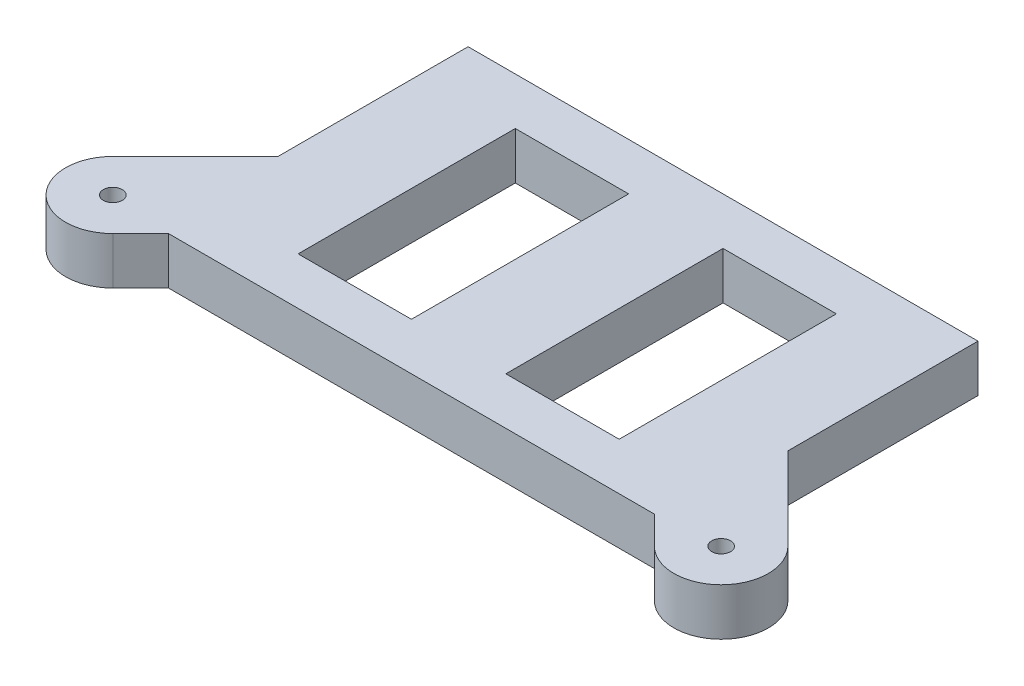
ISO-10303-21;
HEADER;
FILE_DESCRIPTION(('STEP AP214'),'2;1');
FILE_NAME('part.step','',(''),(''),'','','');
FILE_SCHEMA(('AUTOMOTIVE_DESIGN { 1 0 10303 214 1 1 1 1 }'));
ENDSEC;
DATA;
#1=APPLICATION_CONTEXT('core data for automotive mechanical design processes');
#2=APPLICATION_PROTOCOL_DEFINITION('international standard','automotive_design',2000,#1);
#3=PRODUCT_CONTEXT('',#1,'mechanical');
#4=PRODUCT('Part','Part','',(#3));
#5=PRODUCT_RELATED_PRODUCT_CATEGORY('part','',(#4));
#6=PRODUCT_DEFINITION_FORMATION('','',#4);
#7=PRODUCT_DEFINITION_CONTEXT('part definition',#1,'design');
#8=PRODUCT_DEFINITION('design','',#6,#7);
#9=PRODUCT_DEFINITION_SHAPE('','',#8);
#10=(LENGTH_UNIT() NAMED_UNIT(*) SI_UNIT(.MILLI.,.METRE.));
#11=(NAMED_UNIT(*) PLANE_ANGLE_UNIT() SI_UNIT($,.RADIAN.));
#12=(NAMED_UNIT(*) SI_UNIT($,.STERADIAN.) SOLID_ANGLE_UNIT());
#13=UNCERTAINTY_MEASURE_WITH_UNIT(LENGTH_MEASURE(1.E-05),#10,'distance_accuracy_value','');
#14=(GEOMETRIC_REPRESENTATION_CONTEXT(3) GLOBAL_UNCERTAINTY_ASSIGNED_CONTEXT((#13)) GLOBAL_UNIT_ASSIGNED_CONTEXT((#10,
#11,#12)) REPRESENTATION_CONTEXT('',''));
#15=CARTESIAN_POINT('',(0.,0.,0.));
#16=DIRECTION('',(0.,0.,1.));
#17=DIRECTION('',(1.,0.,0.));
#18=AXIS2_PLACEMENT_3D('',#15,#16,#17);
#19=CARTESIAN_POINT('',(0.,5.,0.));
#20=DIRECTION('',(0.,-1.,0.));
#21=DIRECTION('',(0.,0.,-1.));
#22=AXIS2_PLACEMENT_3D('',#19,#20,#21);
#23=PLANE('',#22);
#24=DIRECTION('',(0.,0.,1.));
#25=VECTOR('',#24,1.);
#26=CARTESIAN_POINT('',(10.,5.,-28.));
#27=LINE('',#26,#25);
#28=CARTESIAN_POINT('',(10.,5.,-28.));
#29=VERTEX_POINT('',#28);
#30=CARTESIAN_POINT('',(10.,5.,-5.));
#31=VERTEX_POINT('',#30);
#32=EDGE_CURVE('E303',#29,#31,#27,.T.);
#33=ORIENTED_EDGE('',*,*,#32,.F.);
#34=DIRECTION('',(-1.,0.,0.));
#35=VECTOR('',#34,1.);
#36=CARTESIAN_POINT('',(10.,5.,-28.));
#37=LINE('',#36,#35);
#38=CARTESIAN_POINT('',(22.,5.,-28.));
#39=VERTEX_POINT('',#38);
#40=EDGE_CURVE('E314',#39,#29,#37,.T.);
#41=ORIENTED_EDGE('',*,*,#40,.F.);
#42=DIRECTION('',(0.,0.,-1.));
#43=VECTOR('',#42,1.);
#44=CARTESIAN_POINT('',(22.,5.,-28.));
#45=LINE('',#44,#43);
#46=CARTESIAN_POINT('',(22.,5.,-5.));
#47=VERTEX_POINT('',#46);
#48=EDGE_CURVE('E310',#47,#39,#45,.T.);
#49=ORIENTED_EDGE('',*,*,#48,.F.);
#50=DIRECTION('',(1.,0.,0.));
#51=VECTOR('',#50,1.);
#52=CARTESIAN_POINT('',(10.,5.,-5.));
#53=LINE('',#52,#51);
#54=EDGE_CURVE('E306',#31,#47,#53,.T.);
#55=ORIENTED_EDGE('',*,*,#54,.F.);
#56=EDGE_LOOP('',(#33,#41,#49,#55));
#57=FACE_BOUND('',#56,.T.);
#58=DIRECTION('',(0.,0.,1.));
#59=VECTOR('',#58,1.);
#60=CARTESIAN_POINT('',(0.,5.,0.));
#61=LINE('',#60,#59);
#62=CARTESIAN_POINT('',(0.,5.,-33.));
#63=VERTEX_POINT('',#62);
#64=CARTESIAN_POINT('',(0.,5.,-12.8710678118655));
#65=VERTEX_POINT('',#64);
#66=EDGE_CURVE('E346',#63,#65,#61,.T.);
#67=ORIENTED_EDGE('',*,*,#66,.T.);
#68=DIRECTION('',(0.707106781186544,0.,-0.707106781186551));
#69=VECTOR('',#68,1.);
#70=CARTESIAN_POINT('',(-8.74873734152914,5.,-4.12233047033624));
#71=LINE('',#70,#69);
#72=CARTESIAN_POINT('',(-8.74873734152914,5.,-4.12233047033624));
#73=VERTEX_POINT('',#72);
#74=EDGE_CURVE('E227',#73,#65,#71,.T.);
#75=ORIENTED_EDGE('',*,*,#74,.F.);
#76=CARTESIAN_POINT('',(-5.21320343559638,5.,-0.586796564403524));
#77=DIRECTION('',(0.,-1.,0.));
#78=DIRECTION('',(0.,0.,-1.));
#79=AXIS2_PLACEMENT_3D('',#76,#77,#78);
#80=CIRCLE('',#79,5.);
#81=CARTESIAN_POINT('',(-1.67766952966347,5.,2.94873734152904));
#82=VERTEX_POINT('',#81);
#83=EDGE_CURVE('E223',#82,#73,#80,.T.);
#84=ORIENTED_EDGE('',*,*,#83,.F.);
#85=DIRECTION('',(-0.707106781186544,0.,0.707106781186551));
#86=VECTOR('',#85,1.);
#87=CARTESIAN_POINT('',(-1.67766952966347,5.,2.94873734152904));
#88=LINE('',#87,#86);
#89=CARTESIAN_POINT('',(1.27106781186554,5.,0.));
#90=VERTEX_POINT('',#89);
#91=EDGE_CURVE('E232',#90,#82,#88,.T.);
#92=ORIENTED_EDGE('',*,*,#91,.F.);
#93=DIRECTION('',(1.,0.,0.));
#94=VECTOR('',#93,1.);
#95=CARTESIAN_POINT('',(0.,5.,0.));
#96=LINE('',#95,#94);
#97=CARTESIAN_POINT('',(52.7289321881347,5.,0.));
#98=VERTEX_POINT('',#97);
#99=EDGE_CURVE('E349',#90,#98,#96,.T.);
#100=ORIENTED_EDGE('',*,*,#99,.T.);
#101=DIRECTION('',(-0.70710678118655,0.,-0.707106781186545));
#102=VECTOR('',#101,1.);
#103=CARTESIAN_POINT('',(55.6776695296638,5.,2.94873734152904));
#104=LINE('',#103,#102);
#105=CARTESIAN_POINT('',(55.6776695296638,5.,2.94873734152904));
#106=VERTEX_POINT('',#105);
#107=EDGE_CURVE('E184',#106,#98,#104,.T.);
#108=ORIENTED_EDGE('',*,*,#107,.F.);
#109=CARTESIAN_POINT('',(59.2132034355965,5.,-0.586796564403698));
#110=DIRECTION('',(0.,-1.,0.));
#111=DIRECTION('',(0.,0.,-1.));
#112=AXIS2_PLACEMENT_3D('',#109,#110,#111);
#113=CIRCLE('',#112,4.99999999999999);
#114=CARTESIAN_POINT('',(62.7487373415293,5.,-4.12233047033644));
#115=VERTEX_POINT('',#114);
#116=EDGE_CURVE('E166',#115,#106,#113,.T.);
#117=ORIENTED_EDGE('',*,*,#116,.F.);
#118=DIRECTION('',(0.707106781186549,0.,0.707106781186547));
#119=VECTOR('',#118,1.);
#120=CARTESIAN_POINT('',(62.7487373415293,5.,-4.12233047033644));
#121=LINE('',#120,#119);
#122=CARTESIAN_POINT('',(54.,5.,-12.8710678118657));
#123=VERTEX_POINT('',#122);
#124=EDGE_CURVE('E182',#123,#115,#121,.T.);
#125=ORIENTED_EDGE('',*,*,#124,.F.);
#126=DIRECTION('',(0.,0.,-1.));
#127=VECTOR('',#126,1.);
#128=CARTESIAN_POINT('',(54.,5.,0.));
#129=LINE('',#128,#127);
#130=CARTESIAN_POINT('',(54.,5.,-33.));
#131=VERTEX_POINT('',#130);
#132=EDGE_CURVE('E353',#123,#131,#129,.T.);
#133=ORIENTED_EDGE('',*,*,#132,.T.);
#134=DIRECTION('',(-1.,0.,0.));
#135=VECTOR('',#134,1.);
#136=CARTESIAN_POINT('',(0.,5.,-33.));
#137=LINE('',#136,#135);
#138=EDGE_CURVE('E356',#131,#63,#137,.T.);
#139=ORIENTED_EDGE('',*,*,#138,.T.);
#140=EDGE_LOOP('',(#67,#75,#84,#92,#100,#108,#117,#125,#133,#139));
#141=FACE_BOUND('',#140,.T.);
#142=DIRECTION('',(0.,0.,1.));
#143=VECTOR('',#142,1.);
#144=CARTESIAN_POINT('',(32.,5.,-28.));
#145=LINE('',#144,#143);
#146=CARTESIAN_POINT('',(32.,5.,-28.));
#147=VERTEX_POINT('',#146);
#148=CARTESIAN_POINT('',(32.,5.,-5.));
#149=VERTEX_POINT('',#148);
#150=EDGE_CURVE('E260',#147,#149,#145,.T.);
#151=ORIENTED_EDGE('',*,*,#150,.F.);
#152=DIRECTION('',(-1.,0.,0.));
#153=VECTOR('',#152,1.);
#154=CARTESIAN_POINT('',(32.,5.,-28.));
#155=LINE('',#154,#153);
#156=CARTESIAN_POINT('',(44.,5.,-28.));
#157=VERTEX_POINT('',#156);
#158=EDGE_CURVE('E271',#157,#147,#155,.T.);
#159=ORIENTED_EDGE('',*,*,#158,.F.);
#160=DIRECTION('',(0.,0.,-1.));
#161=VECTOR('',#160,1.);
#162=CARTESIAN_POINT('',(44.,5.,-28.));
#163=LINE('',#162,#161);
#164=CARTESIAN_POINT('',(44.,5.,-5.));
#165=VERTEX_POINT('',#164);
#166=EDGE_CURVE('E267',#165,#157,#163,.T.);
#167=ORIENTED_EDGE('',*,*,#166,.F.);
#168=DIRECTION('',(1.,0.,0.));
#169=VECTOR('',#168,1.);
#170=CARTESIAN_POINT('',(32.,5.,-5.));
#171=LINE('',#170,#169);
#172=EDGE_CURVE('E263',#149,#165,#171,.T.);
#173=ORIENTED_EDGE('',*,*,#172,.F.);
#174=EDGE_LOOP('',(#151,#159,#167,#173));
#175=FACE_BOUND('',#174,.T.);
#176=CARTESIAN_POINT('',(-5.21320343559638,5.,-0.586796564403524));
#177=DIRECTION('',(0.,-1.,0.));
#178=DIRECTION('',(0.,0.,-1.));
#179=AXIS2_PLACEMENT_3D('',#176,#177,#178);
#180=CIRCLE('',#179,1.);
#181=CARTESIAN_POINT('',(-5.21320343559638,5.,-1.58679656440352));
#182=VERTEX_POINT('',#181);
#183=EDGE_CURVE('E215',#182,#182,#180,.T.);
#184=ORIENTED_EDGE('',*,*,#183,.T.);
#185=EDGE_LOOP('',(#184));
#186=FACE_BOUND('',#185,.T.);
#187=CARTESIAN_POINT('',(59.2132034355965,5.,-0.586796564403698));
#188=DIRECTION('',(0.,-1.,0.));
#189=DIRECTION('',(0.,0.,-1.));
#190=AXIS2_PLACEMENT_3D('',#187,#188,#189);
#191=CIRCLE('',#190,0.999999999999998);
#192=CARTESIAN_POINT('',(59.2132034355965,5.,-1.5867965644037));
#193=VERTEX_POINT('',#192);
#194=EDGE_CURVE('E205',#193,#193,#191,.T.);
#195=ORIENTED_EDGE('',*,*,#194,.T.);
#196=EDGE_LOOP('',(#195));
#197=FACE_BOUND('',#196,.T.);
#198=ADVANCED_FACE('F39',(#57,#141,#175,#186,#197),#23,.F.);
#199=CARTESIAN_POINT('',(0.,0.,0.));
#200=DIRECTION('',(0.,-1.,0.));
#201=DIRECTION('',(0.,0.,-1.));
#202=AXIS2_PLACEMENT_3D('',#199,#200,#201);
#203=PLANE('',#202);
#204=DIRECTION('',(0.,0.,1.));
#205=VECTOR('',#204,1.);
#206=CARTESIAN_POINT('',(0.,0.,0.));
#207=LINE('',#206,#205);
#208=CARTESIAN_POINT('',(0.,0.,-33.));
#209=VERTEX_POINT('',#208);
#210=CARTESIAN_POINT('',(0.,0.,-12.8710678118655));
#211=VERTEX_POINT('',#210);
#212=EDGE_CURVE('E345',#209,#211,#207,.T.);
#213=ORIENTED_EDGE('',*,*,#212,.F.);
#214=DIRECTION('',(-1.,0.,0.));
#215=VECTOR('',#214,1.);
#216=CARTESIAN_POINT('',(0.,0.,-33.));
#217=LINE('',#216,#215);
#218=CARTESIAN_POINT('',(54.,0.,-33.));
#219=VERTEX_POINT('',#218);
#220=EDGE_CURVE('E350',#219,#209,#217,.T.);
#221=ORIENTED_EDGE('',*,*,#220,.F.);
#222=DIRECTION('',(0.,0.,-1.));
#223=VECTOR('',#222,1.);
#224=CARTESIAN_POINT('',(54.,0.,0.));
#225=LINE('',#224,#223);
#226=CARTESIAN_POINT('',(54.,0.,-12.8710678118657));
#227=VERTEX_POINT('',#226);
#228=EDGE_CURVE('E363',#227,#219,#225,.T.);
#229=ORIENTED_EDGE('',*,*,#228,.F.);
#230=DIRECTION('',(0.707106781186549,0.,0.707106781186547));
#231=VECTOR('',#230,1.);
#232=CARTESIAN_POINT('',(62.7487373415293,0.,-4.12233047033644));
#233=LINE('',#232,#231);
#234=CARTESIAN_POINT('',(62.7487373415293,0.,-4.12233047033644));
#235=VERTEX_POINT('',#234);
#236=EDGE_CURVE('E202',#227,#235,#233,.T.);
#237=ORIENTED_EDGE('',*,*,#236,.T.);
#238=CARTESIAN_POINT('',(59.2132034355965,0.,-0.586796564403698));
#239=DIRECTION('',(0.,-1.,0.));
#240=DIRECTION('',(0.,0.,-1.));
#241=AXIS2_PLACEMENT_3D('',#238,#239,#240);
#242=CIRCLE('',#241,4.99999999999999);
#243=CARTESIAN_POINT('',(55.6776695296638,0.,2.94873734152904));
#244=VERTEX_POINT('',#243);
#245=EDGE_CURVE('E168',#235,#244,#242,.T.);
#246=ORIENTED_EDGE('',*,*,#245,.T.);
#247=DIRECTION('',(-0.70710678118655,0.,-0.707106781186545));
#248=VECTOR('',#247,1.);
#249=CARTESIAN_POINT('',(55.6776695296638,0.,2.94873734152904));
#250=LINE('',#249,#248);
#251=CARTESIAN_POINT('',(52.7289321881347,0.,0.));
#252=VERTEX_POINT('',#251);
#253=EDGE_CURVE('E191',#244,#252,#250,.T.);
#254=ORIENTED_EDGE('',*,*,#253,.T.);
#255=DIRECTION('',(1.,0.,0.));
#256=VECTOR('',#255,1.);
#257=CARTESIAN_POINT('',(0.,0.,0.));
#258=LINE('',#257,#256);
#259=CARTESIAN_POINT('',(1.27106781186554,0.,0.));
#260=VERTEX_POINT('',#259);
#261=EDGE_CURVE('E55',#260,#252,#258,.T.);
#262=ORIENTED_EDGE('',*,*,#261,.F.);
#263=DIRECTION('',(-0.707106781186544,0.,0.707106781186551));
#264=VECTOR('',#263,1.);
#265=CARTESIAN_POINT('',(-1.67766952966347,0.,2.94873734152904));
#266=LINE('',#265,#264);
#267=CARTESIAN_POINT('',(-1.67766952966347,0.,2.94873734152904));
#268=VERTEX_POINT('',#267);
#269=EDGE_CURVE('E228',#260,#268,#266,.T.);
#270=ORIENTED_EDGE('',*,*,#269,.T.);
#271=CARTESIAN_POINT('',(-5.21320343559638,0.,-0.586796564403524));
#272=DIRECTION('',(0.,-1.,0.));
#273=DIRECTION('',(0.,0.,-1.));
#274=AXIS2_PLACEMENT_3D('',#271,#272,#273);
#275=CIRCLE('',#274,5.);
#276=CARTESIAN_POINT('',(-8.74873734152914,0.,-4.12233047033624));
#277=VERTEX_POINT('',#276);
#278=EDGE_CURVE('E219',#268,#277,#275,.T.);
#279=ORIENTED_EDGE('',*,*,#278,.T.);
#280=DIRECTION('',(0.707106781186544,0.,-0.707106781186551));
#281=VECTOR('',#280,1.);
#282=CARTESIAN_POINT('',(-8.74873734152914,0.,-4.12233047033624));
#283=LINE('',#282,#281);
#284=EDGE_CURVE('E240',#277,#211,#283,.T.);
#285=ORIENTED_EDGE('',*,*,#284,.T.);
#286=EDGE_LOOP('',(#213,#221,#229,#237,#246,#254,#262,#270,#279,#285));
#287=FACE_BOUND('',#286,.T.);
#288=DIRECTION('',(-1.,0.,0.));
#289=VECTOR('',#288,1.);
#290=CARTESIAN_POINT('',(10.,0.,-28.));
#291=LINE('',#290,#289);
#292=CARTESIAN_POINT('',(22.,0.,-28.));
#293=VERTEX_POINT('',#292);
#294=CARTESIAN_POINT('',(10.,0.,-28.));
#295=VERTEX_POINT('',#294);
#296=EDGE_CURVE('E307',#293,#295,#291,.T.);
#297=ORIENTED_EDGE('',*,*,#296,.T.);
#298=DIRECTION('',(0.,0.,1.));
#299=VECTOR('',#298,1.);
#300=CARTESIAN_POINT('',(10.,0.,-28.));
#301=LINE('',#300,#299);
#302=CARTESIAN_POINT('',(10.,0.,-5.));
#303=VERTEX_POINT('',#302);
#304=EDGE_CURVE('E302',#295,#303,#301,.T.);
#305=ORIENTED_EDGE('',*,*,#304,.T.);
#306=DIRECTION('',(1.,0.,0.));
#307=VECTOR('',#306,1.);
#308=CARTESIAN_POINT('',(10.,0.,-5.));
#309=LINE('',#308,#307);
#310=CARTESIAN_POINT('',(22.,0.,-5.));
#311=VERTEX_POINT('',#310);
#312=EDGE_CURVE('E321',#303,#311,#309,.T.);
#313=ORIENTED_EDGE('',*,*,#312,.T.);
#314=DIRECTION('',(0.,0.,-1.));
#315=VECTOR('',#314,1.);
#316=CARTESIAN_POINT('',(22.,0.,-28.));
#317=LINE('',#316,#315);
#318=EDGE_CURVE('E325',#311,#293,#317,.T.);
#319=ORIENTED_EDGE('',*,*,#318,.T.);
#320=EDGE_LOOP('',(#297,#305,#313,#319));
#321=FACE_BOUND('',#320,.T.);
#322=DIRECTION('',(-1.,0.,0.));
#323=VECTOR('',#322,1.);
#324=CARTESIAN_POINT('',(32.,0.,-28.));
#325=LINE('',#324,#323);
#326=CARTESIAN_POINT('',(44.,0.,-28.));
#327=VERTEX_POINT('',#326);
#328=CARTESIAN_POINT('',(32.,0.,-28.));
#329=VERTEX_POINT('',#328);
#330=EDGE_CURVE('E264',#327,#329,#325,.T.);
#331=ORIENTED_EDGE('',*,*,#330,.T.);
#332=DIRECTION('',(0.,0.,1.));
#333=VECTOR('',#332,1.);
#334=CARTESIAN_POINT('',(32.,0.,-28.));
#335=LINE('',#334,#333);
#336=CARTESIAN_POINT('',(32.,0.,-5.));
#337=VERTEX_POINT('',#336);
#338=EDGE_CURVE('E250',#329,#337,#335,.T.);
#339=ORIENTED_EDGE('',*,*,#338,.T.);
#340=DIRECTION('',(1.,0.,0.));
#341=VECTOR('',#340,1.);
#342=CARTESIAN_POINT('',(32.,0.,-5.));
#343=LINE('',#342,#341);
#344=CARTESIAN_POINT('',(44.,0.,-5.));
#345=VERTEX_POINT('',#344);
#346=EDGE_CURVE('E278',#337,#345,#343,.T.);
#347=ORIENTED_EDGE('',*,*,#346,.T.);
#348=DIRECTION('',(0.,0.,-1.));
#349=VECTOR('',#348,1.);
#350=CARTESIAN_POINT('',(44.,0.,-28.));
#351=LINE('',#350,#349);
#352=EDGE_CURVE('E282',#345,#327,#351,.T.);
#353=ORIENTED_EDGE('',*,*,#352,.T.);
#354=EDGE_LOOP('',(#331,#339,#347,#353));
#355=FACE_BOUND('',#354,.T.);
#356=CARTESIAN_POINT('',(-5.21320343559638,0.,-0.586796564403524));
#357=DIRECTION('',(0.,-1.,0.));
#358=DIRECTION('',(0.,0.,-1.));
#359=AXIS2_PLACEMENT_3D('',#356,#357,#358);
#360=CIRCLE('',#359,1.);
#361=CARTESIAN_POINT('',(-5.21320343559638,0.,-1.58679656440352));
#362=VERTEX_POINT('',#361);
#363=EDGE_CURVE('E210',#362,#362,#360,.T.);
#364=ORIENTED_EDGE('',*,*,#363,.F.);
#365=EDGE_LOOP('',(#364));
#366=FACE_BOUND('',#365,.T.);
#367=CARTESIAN_POINT('',(59.2132034355965,0.,-0.586796564403698));
#368=DIRECTION('',(0.,-1.,0.));
#369=DIRECTION('',(0.,0.,-1.));
#370=AXIS2_PLACEMENT_3D('',#367,#368,#369);
#371=CIRCLE('',#370,0.999999999999998);
#372=CARTESIAN_POINT('',(59.2132034355965,0.,-1.5867965644037));
#373=VERTEX_POINT('',#372);
#374=EDGE_CURVE('E197',#373,#373,#371,.T.);
#375=ORIENTED_EDGE('',*,*,#374,.F.);
#376=EDGE_LOOP('',(#375));
#377=FACE_BOUND('',#376,.T.);
#378=ADVANCED_FACE('F377',(#287,#321,#355,#366,#377),#203,.T.);
#379=CARTESIAN_POINT('',(0.,5.,0.));
#380=DIRECTION('',(1.,0.,0.));
#381=DIRECTION('',(0.,0.,-1.));
#382=AXIS2_PLACEMENT_3D('',#379,#380,#381);
#383=PLANE('',#382);
#384=ORIENTED_EDGE('',*,*,#212,.T.);
#385=DIRECTION('',(0.,-1.,0.));
#386=VECTOR('',#385,1.);
#387=CARTESIAN_POINT('',(0.,5.,-12.8710678118655));
#388=LINE('',#387,#386);
#389=EDGE_CURVE('E254',#65,#211,#388,.T.);
#390=ORIENTED_EDGE('',*,*,#389,.F.);
#391=ORIENTED_EDGE('',*,*,#66,.F.);
#392=DIRECTION('',(0.,-1.,0.));
#393=VECTOR('',#392,1.);
#394=CARTESIAN_POINT('',(0.,5.,-33.));
#395=LINE('',#394,#393);
#396=EDGE_CURVE('E48',#63,#209,#395,.T.);
#397=ORIENTED_EDGE('',*,*,#396,.T.);
#398=EDGE_LOOP('',(#384,#390,#391,#397));
#399=FACE_BOUND('',#398,.T.);
#400=ADVANCED_FACE('F41',(#399),#383,.F.);
#401=CARTESIAN_POINT('',(0.,5.,0.));
#402=DIRECTION('',(0.,0.,-1.));
#403=DIRECTION('',(-1.,0.,0.));
#404=AXIS2_PLACEMENT_3D('',#401,#402,#403);
#405=PLANE('',#404);
#406=ORIENTED_EDGE('',*,*,#261,.T.);
#407=DIRECTION('',(0.,-1.,0.));
#408=VECTOR('',#407,1.);
#409=CARTESIAN_POINT('',(52.7289321881347,5.,0.));
#410=LINE('',#409,#408);
#411=EDGE_CURVE('E59',#98,#252,#410,.T.);
#412=ORIENTED_EDGE('',*,*,#411,.F.);
#413=ORIENTED_EDGE('',*,*,#99,.F.);
#414=DIRECTION('',(0.,-1.,0.));
#415=VECTOR('',#414,1.);
#416=CARTESIAN_POINT('',(1.27106781186554,5.,0.));
#417=LINE('',#416,#415);
#418=EDGE_CURVE('E251',#90,#260,#417,.T.);
#419=ORIENTED_EDGE('',*,*,#418,.T.);
#420=EDGE_LOOP('',(#406,#412,#413,#419));
#421=FACE_BOUND('',#420,.T.);
#422=ADVANCED_FACE('F419',(#421),#405,.F.);
#423=CARTESIAN_POINT('',(54.,5.,0.));
#424=DIRECTION('',(-1.,0.,0.));
#425=DIRECTION('',(0.,0.,1.));
#426=AXIS2_PLACEMENT_3D('',#423,#424,#425);
#427=PLANE('',#426);
#428=ORIENTED_EDGE('',*,*,#132,.F.);
#429=DIRECTION('',(0.,-1.,0.));
#430=VECTOR('',#429,1.);
#431=CARTESIAN_POINT('',(54.,5.,-12.8710678118657));
#432=LINE('',#431,#430);
#433=EDGE_CURVE('E175',#123,#227,#432,.T.);
#434=ORIENTED_EDGE('',*,*,#433,.T.);
#435=ORIENTED_EDGE('',*,*,#228,.T.);
#436=DIRECTION('',(0.,-1.,0.));
#437=VECTOR('',#436,1.);
#438=CARTESIAN_POINT('',(54.,5.,-33.));
#439=LINE('',#438,#437);
#440=EDGE_CURVE('E11',#131,#219,#439,.T.);
#441=ORIENTED_EDGE('',*,*,#440,.F.);
#442=EDGE_LOOP('',(#428,#434,#435,#441));
#443=FACE_BOUND('',#442,.T.);
#444=ADVANCED_FACE('F388',(#443),#427,.F.);
#445=CARTESIAN_POINT('',(0.,5.,-33.));
#446=DIRECTION('',(0.,0.,1.));
#447=DIRECTION('',(1.,0.,0.));
#448=AXIS2_PLACEMENT_3D('',#445,#446,#447);
#449=PLANE('',#448);
#450=ORIENTED_EDGE('',*,*,#220,.T.);
#451=ORIENTED_EDGE('',*,*,#396,.F.);
#452=ORIENTED_EDGE('',*,*,#138,.F.);
#453=ORIENTED_EDGE('',*,*,#440,.T.);
#454=EDGE_LOOP('',(#450,#451,#452,#453));
#455=FACE_BOUND('',#454,.T.);
#456=ADVANCED_FACE('F386',(#455),#449,.F.);
#457=CARTESIAN_POINT('',(10.,5.,-28.));
#458=DIRECTION('',(1.,0.,0.));
#459=DIRECTION('',(0.,0.,-1.));
#460=AXIS2_PLACEMENT_3D('',#457,#458,#459);
#461=PLANE('',#460);
#462=ORIENTED_EDGE('',*,*,#304,.F.);
#463=DIRECTION('',(0.,-1.,0.));
#464=VECTOR('',#463,1.);
#465=CARTESIAN_POINT('',(10.,5.,-28.));
#466=LINE('',#465,#464);
#467=EDGE_CURVE('E317',#29,#295,#466,.T.);
#468=ORIENTED_EDGE('',*,*,#467,.F.);
#469=ORIENTED_EDGE('',*,*,#32,.T.);
#470=DIRECTION('',(0.,-1.,0.));
#471=VECTOR('',#470,1.);
#472=CARTESIAN_POINT('',(10.,5.,-5.));
#473=LINE('',#472,#471);
#474=EDGE_CURVE('E341',#31,#303,#473,.T.);
#475=ORIENTED_EDGE('',*,*,#474,.T.);
#476=EDGE_LOOP('',(#462,#468,#469,#475));
#477=FACE_BOUND('',#476,.T.);
#478=ADVANCED_FACE('F413',(#477),#461,.T.);
#479=CARTESIAN_POINT('',(10.,5.,-5.));
#480=DIRECTION('',(0.,0.,-1.));
#481=DIRECTION('',(-1.,0.,0.));
#482=AXIS2_PLACEMENT_3D('',#479,#480,#481);
#483=PLANE('',#482);
#484=ORIENTED_EDGE('',*,*,#312,.F.);
#485=ORIENTED_EDGE('',*,*,#474,.F.);
#486=ORIENTED_EDGE('',*,*,#54,.T.);
#487=DIRECTION('',(0.,-1.,0.));
#488=VECTOR('',#487,1.);
#489=CARTESIAN_POINT('',(22.,5.,-5.));
#490=LINE('',#489,#488);
#491=EDGE_CURVE('E338',#47,#311,#490,.T.);
#492=ORIENTED_EDGE('',*,*,#491,.T.);
#493=EDGE_LOOP('',(#484,#485,#486,#492));
#494=FACE_BOUND('',#493,.T.);
#495=ADVANCED_FACE('F498',(#494),#483,.T.);
#496=CARTESIAN_POINT('',(22.,5.,-28.));
#497=DIRECTION('',(-1.,0.,0.));
#498=DIRECTION('',(0.,0.,1.));
#499=AXIS2_PLACEMENT_3D('',#496,#497,#498);
#500=PLANE('',#499);
#501=ORIENTED_EDGE('',*,*,#318,.F.);
#502=ORIENTED_EDGE('',*,*,#491,.F.);
#503=ORIENTED_EDGE('',*,*,#48,.T.);
#504=DIRECTION('',(0.,-1.,0.));
#505=VECTOR('',#504,1.);
#506=CARTESIAN_POINT('',(22.,5.,-28.));
#507=LINE('',#506,#505);
#508=EDGE_CURVE('E335',#39,#293,#507,.T.);
#509=ORIENTED_EDGE('',*,*,#508,.T.);
#510=EDGE_LOOP('',(#501,#502,#503,#509));
#511=FACE_BOUND('',#510,.T.);
#512=ADVANCED_FACE('F488',(#511),#500,.T.);
#513=CARTESIAN_POINT('',(10.,5.,-28.));
#514=DIRECTION('',(0.,0.,1.));
#515=DIRECTION('',(1.,0.,0.));
#516=AXIS2_PLACEMENT_3D('',#513,#514,#515);
#517=PLANE('',#516);
#518=ORIENTED_EDGE('',*,*,#296,.F.);
#519=ORIENTED_EDGE('',*,*,#508,.F.);
#520=ORIENTED_EDGE('',*,*,#40,.T.);
#521=ORIENTED_EDGE('',*,*,#467,.T.);
#522=EDGE_LOOP('',(#518,#519,#520,#521));
#523=FACE_BOUND('',#522,.T.);
#524=ADVANCED_FACE('F478',(#523),#517,.T.);
#525=CARTESIAN_POINT('',(32.,5.,-28.));
#526=DIRECTION('',(1.,0.,0.));
#527=DIRECTION('',(0.,0.,-1.));
#528=AXIS2_PLACEMENT_3D('',#525,#526,#527);
#529=PLANE('',#528);
#530=ORIENTED_EDGE('',*,*,#338,.F.);
#531=DIRECTION('',(0.,-1.,0.));
#532=VECTOR('',#531,1.);
#533=CARTESIAN_POINT('',(32.,5.,-28.));
#534=LINE('',#533,#532);
#535=EDGE_CURVE('E274',#147,#329,#534,.T.);
#536=ORIENTED_EDGE('',*,*,#535,.F.);
#537=ORIENTED_EDGE('',*,*,#150,.T.);
#538=DIRECTION('',(0.,-1.,0.));
#539=VECTOR('',#538,1.);
#540=CARTESIAN_POINT('',(32.,5.,-5.));
#541=LINE('',#540,#539);
#542=EDGE_CURVE('E298',#149,#337,#541,.T.);
#543=ORIENTED_EDGE('',*,*,#542,.T.);
#544=EDGE_LOOP('',(#530,#536,#537,#543));
#545=FACE_BOUND('',#544,.T.);
#546=ADVANCED_FACE('F468',(#545),#529,.T.);
#547=CARTESIAN_POINT('',(32.,5.,-5.));
#548=DIRECTION('',(0.,0.,-1.));
#549=DIRECTION('',(-1.,0.,0.));
#550=AXIS2_PLACEMENT_3D('',#547,#548,#549);
#551=PLANE('',#550);
#552=ORIENTED_EDGE('',*,*,#346,.F.);
#553=ORIENTED_EDGE('',*,*,#542,.F.);
#554=ORIENTED_EDGE('',*,*,#172,.T.);
#555=DIRECTION('',(0.,-1.,0.));
#556=VECTOR('',#555,1.);
#557=CARTESIAN_POINT('',(44.,5.,-5.));
#558=LINE('',#557,#556);
#559=EDGE_CURVE('E295',#165,#345,#558,.T.);
#560=ORIENTED_EDGE('',*,*,#559,.T.);
#561=EDGE_LOOP('',(#552,#553,#554,#560));
#562=FACE_BOUND('',#561,.T.);
#563=ADVANCED_FACE('F458',(#562),#551,.T.);
#564=CARTESIAN_POINT('',(44.,5.,-28.));
#565=DIRECTION('',(-1.,0.,0.));
#566=DIRECTION('',(0.,0.,1.));
#567=AXIS2_PLACEMENT_3D('',#564,#565,#566);
#568=PLANE('',#567);
#569=ORIENTED_EDGE('',*,*,#352,.F.);
#570=ORIENTED_EDGE('',*,*,#559,.F.);
#571=ORIENTED_EDGE('',*,*,#166,.T.);
#572=DIRECTION('',(0.,-1.,0.));
#573=VECTOR('',#572,1.);
#574=CARTESIAN_POINT('',(44.,5.,-28.));
#575=LINE('',#574,#573);
#576=EDGE_CURVE('E292',#157,#327,#575,.T.);
#577=ORIENTED_EDGE('',*,*,#576,.T.);
#578=EDGE_LOOP('',(#569,#570,#571,#577));
#579=FACE_BOUND('',#578,.T.);
#580=ADVANCED_FACE('F448',(#579),#568,.T.);
#581=CARTESIAN_POINT('',(32.,5.,-28.));
#582=DIRECTION('',(0.,0.,1.));
#583=DIRECTION('',(1.,0.,0.));
#584=AXIS2_PLACEMENT_3D('',#581,#582,#583);
#585=PLANE('',#584);
#586=ORIENTED_EDGE('',*,*,#330,.F.);
#587=ORIENTED_EDGE('',*,*,#576,.F.);
#588=ORIENTED_EDGE('',*,*,#158,.T.);
#589=ORIENTED_EDGE('',*,*,#535,.T.);
#590=EDGE_LOOP('',(#586,#587,#588,#589));
#591=FACE_BOUND('',#590,.T.);
#592=ADVANCED_FACE('F443',(#591),#585,.T.);
#593=CARTESIAN_POINT('',(-5.21320343559638,5.,-0.586796564403524));
#594=DIRECTION('',(0.,-1.,0.));
#595=DIRECTION('',(0.,0.,-1.));
#596=AXIS2_PLACEMENT_3D('',#593,#594,#595);
#597=CYLINDRICAL_SURFACE('',#596,5.);
#598=ORIENTED_EDGE('',*,*,#278,.F.);
#599=DIRECTION('',(0.,-1.,0.));
#600=VECTOR('',#599,1.);
#601=CARTESIAN_POINT('',(-1.67766952966347,5.,2.94873734152904));
#602=LINE('',#601,#600);
#603=EDGE_CURVE('E247',#82,#268,#602,.T.);
#604=ORIENTED_EDGE('',*,*,#603,.F.);
#605=ORIENTED_EDGE('',*,*,#83,.T.);
#606=DIRECTION('',(0.,-1.,0.));
#607=VECTOR('',#606,1.);
#608=CARTESIAN_POINT('',(-8.74873734152914,5.,-4.12233047033624));
#609=LINE('',#608,#607);
#610=EDGE_CURVE('E236',#73,#277,#609,.T.);
#611=ORIENTED_EDGE('',*,*,#610,.T.);
#612=EDGE_LOOP('',(#598,#604,#605,#611));
#613=FACE_BOUND('',#612,.T.);
#614=ADVANCED_FACE('F447',(#613),#597,.T.);
#615=CARTESIAN_POINT('',(-1.67766952966347,5.,2.94873734152904));
#616=DIRECTION('',(0.707106781186551,0.,0.707106781186544));
#617=DIRECTION('',(0.707106781186544,0.,-0.707106781186551));
#618=AXIS2_PLACEMENT_3D('',#615,#616,#617);
#619=PLANE('',#618);
#620=ORIENTED_EDGE('',*,*,#269,.F.);
#621=ORIENTED_EDGE('',*,*,#418,.F.);
#622=ORIENTED_EDGE('',*,*,#91,.T.);
#623=ORIENTED_EDGE('',*,*,#603,.T.);
#624=EDGE_LOOP('',(#620,#621,#622,#623));
#625=FACE_BOUND('',#624,.T.);
#626=ADVANCED_FACE('F550',(#625),#619,.T.);
#627=CARTESIAN_POINT('',(-8.74873734152914,5.,-4.12233047033624));
#628=DIRECTION('',(-0.707106781186551,0.,-0.707106781186544));
#629=DIRECTION('',(-0.707106781186544,0.,0.707106781186551));
#630=AXIS2_PLACEMENT_3D('',#627,#628,#629);
#631=PLANE('',#630);
#632=ORIENTED_EDGE('',*,*,#284,.F.);
#633=ORIENTED_EDGE('',*,*,#610,.F.);
#634=ORIENTED_EDGE('',*,*,#74,.T.);
#635=ORIENTED_EDGE('',*,*,#389,.T.);
#636=EDGE_LOOP('',(#632,#633,#634,#635));
#637=FACE_BOUND('',#636,.T.);
#638=ADVANCED_FACE('F382',(#637),#631,.T.);
#639=CARTESIAN_POINT('',(-5.21320343559638,5.,-0.586796564403524));
#640=DIRECTION('',(0.,-1.,0.));
#641=DIRECTION('',(0.,0.,-1.));
#642=AXIS2_PLACEMENT_3D('',#639,#640,#641);
#643=CYLINDRICAL_SURFACE('',#642,1.);
#644=ORIENTED_EDGE('',*,*,#183,.F.);
#645=EDGE_LOOP('',(#644));
#646=FACE_BOUND('',#645,.T.);
#647=ORIENTED_EDGE('',*,*,#363,.T.);
#648=EDGE_LOOP('',(#647));
#649=FACE_BOUND('',#648,.T.);
#650=ADVANCED_FACE('F393',(#646,#649),#643,.F.);
#651=CARTESIAN_POINT('',(55.6776695296638,5.,2.94873734152904));
#652=DIRECTION('',(-0.707106781186545,0.,0.70710678118655));
#653=DIRECTION('',(0.70710678118655,0.,0.707106781186545));
#654=AXIS2_PLACEMENT_3D('',#651,#652,#653);
#655=PLANE('',#654);
#656=ORIENTED_EDGE('',*,*,#253,.F.);
#657=DIRECTION('',(0.,-1.,0.));
#658=VECTOR('',#657,1.);
#659=CARTESIAN_POINT('',(55.6776695296638,5.,2.94873734152904));
#660=LINE('',#659,#658);
#661=EDGE_CURVE('E174',#106,#244,#660,.T.);
#662=ORIENTED_EDGE('',*,*,#661,.F.);
#663=ORIENTED_EDGE('',*,*,#107,.T.);
#664=ORIENTED_EDGE('',*,*,#411,.T.);
#665=EDGE_LOOP('',(#656,#662,#663,#664));
#666=FACE_BOUND('',#665,.T.);
#667=ADVANCED_FACE('F391',(#666),#655,.T.);
#668=CARTESIAN_POINT('',(59.2132034355965,5.,-0.586796564403698));
#669=DIRECTION('',(0.,-1.,0.));
#670=DIRECTION('',(0.,0.,-1.));
#671=AXIS2_PLACEMENT_3D('',#668,#669,#670);
#672=CYLINDRICAL_SURFACE('',#671,4.99999999999999);
#673=ORIENTED_EDGE('',*,*,#245,.F.);
#674=DIRECTION('',(0.,-1.,0.));
#675=VECTOR('',#674,1.);
#676=CARTESIAN_POINT('',(62.7487373415293,5.,-4.12233047033644));
#677=LINE('',#676,#675);
#678=EDGE_CURVE('E163',#115,#235,#677,.T.);
#679=ORIENTED_EDGE('',*,*,#678,.F.);
#680=ORIENTED_EDGE('',*,*,#116,.T.);
#681=ORIENTED_EDGE('',*,*,#661,.T.);
#682=EDGE_LOOP('',(#673,#679,#680,#681));
#683=FACE_BOUND('',#682,.T.);
#684=ADVANCED_FACE('F165',(#683),#672,.T.);
#685=CARTESIAN_POINT('',(62.7487373415293,5.,-4.12233047033644));
#686=DIRECTION('',(0.707106781186547,0.,-0.707106781186549));
#687=DIRECTION('',(-0.707106781186549,0.,-0.707106781186547));
#688=AXIS2_PLACEMENT_3D('',#685,#686,#687);
#689=PLANE('',#688);
#690=ORIENTED_EDGE('',*,*,#236,.F.);
#691=ORIENTED_EDGE('',*,*,#433,.F.);
#692=ORIENTED_EDGE('',*,*,#124,.T.);
#693=ORIENTED_EDGE('',*,*,#678,.T.);
#694=EDGE_LOOP('',(#690,#691,#692,#693));
#695=FACE_BOUND('',#694,.T.);
#696=ADVANCED_FACE('F188',(#695),#689,.T.);
#697=CARTESIAN_POINT('',(59.2132034355965,5.,-0.586796564403698));
#698=DIRECTION('',(0.,-1.,0.));
#699=DIRECTION('',(0.,0.,-1.));
#700=AXIS2_PLACEMENT_3D('',#697,#698,#699);
#701=CYLINDRICAL_SURFACE('',#700,0.999999999999998);
#702=ORIENTED_EDGE('',*,*,#194,.F.);
#703=EDGE_LOOP('',(#702));
#704=FACE_BOUND('',#703,.T.);
#705=ORIENTED_EDGE('',*,*,#374,.T.);
#706=EDGE_LOOP('',(#705));
#707=FACE_BOUND('',#706,.T.);
#708=ADVANCED_FACE('F593',(#704,#707),#701,.F.);
#709=CLOSED_SHELL('',(#198,#378,#400,#422,#444,#456,#478,#495,#512,#524,#546,#563,#580,#592,
#614,#626,#638,#650,#667,#684,#696,#708));
#710=MANIFOLD_SOLID_BREP('B2',#709);
#711=ADVANCED_BREP_SHAPE_REPRESENTATION('',(#18,#710),#14);
#712=SHAPE_DEFINITION_REPRESENTATION(#9,#711);
ENDSEC;
END-ISO-10303-21;
